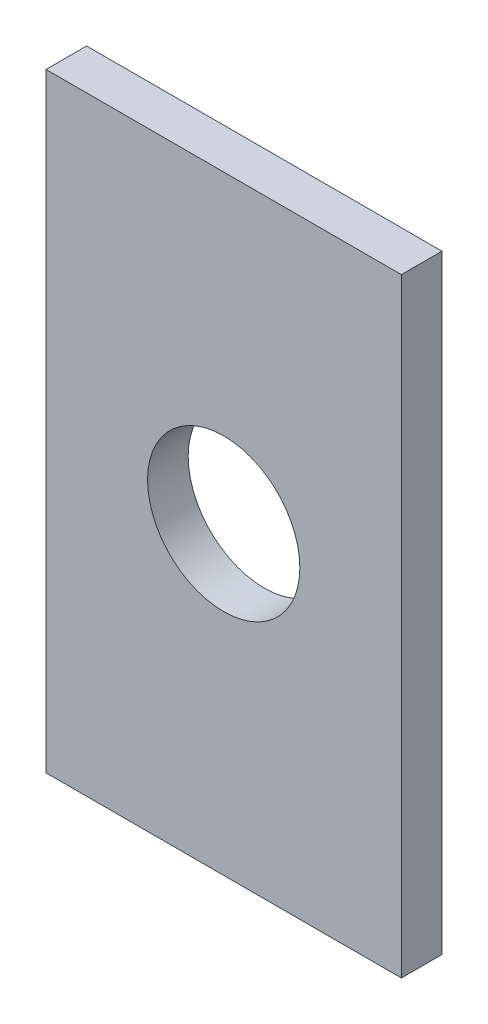
ISO-10303-21;
HEADER;
FILE_DESCRIPTION(('STEP AP214'),'2;1');
FILE_NAME('part.step','',(''),(''),'','','');
FILE_SCHEMA(('AUTOMOTIVE_DESIGN { 1 0 10303 214 1 1 1 1 }'));
ENDSEC;
DATA;
#1=APPLICATION_CONTEXT('core data for automotive mechanical design processes');
#2=APPLICATION_PROTOCOL_DEFINITION('international standard','automotive_design',2000,#1);
#3=PRODUCT_CONTEXT('',#1,'mechanical');
#4=PRODUCT('Part','Part','',(#3));
#5=PRODUCT_RELATED_PRODUCT_CATEGORY('part','',(#4));
#6=PRODUCT_DEFINITION_FORMATION('','',#4);
#7=PRODUCT_DEFINITION_CONTEXT('part definition',#1,'design');
#8=PRODUCT_DEFINITION('design','',#6,#7);
#9=PRODUCT_DEFINITION_SHAPE('','',#8);
#10=(LENGTH_UNIT() NAMED_UNIT(*) SI_UNIT(.MILLI.,.METRE.));
#11=(NAMED_UNIT(*) PLANE_ANGLE_UNIT() SI_UNIT($,.RADIAN.));
#12=(NAMED_UNIT(*) SI_UNIT($,.STERADIAN.) SOLID_ANGLE_UNIT());
#13=UNCERTAINTY_MEASURE_WITH_UNIT(LENGTH_MEASURE(1.E-05),#10,'distance_accuracy_value','');
#14=(GEOMETRIC_REPRESENTATION_CONTEXT(3) GLOBAL_UNCERTAINTY_ASSIGNED_CONTEXT((#13)) GLOBAL_UNIT_ASSIGNED_CONTEXT((#10,
#11,#12)) REPRESENTATION_CONTEXT('',''));
#15=CARTESIAN_POINT('',(0.,0.,0.));
#16=DIRECTION('',(0.,0.,1.));
#17=DIRECTION('',(1.,0.,0.));
#18=AXIS2_PLACEMENT_3D('',#15,#16,#17);
#19=CARTESIAN_POINT('',(73.5000001639128,11.5000002980232,16.3));
#20=DIRECTION('',(0.,0.,1.));
#21=DIRECTION('',(1.,0.,0.));
#22=AXIS2_PLACEMENT_3D('',#19,#20,#21);
#23=PLANE('',#22);
#24=CARTESIAN_POINT('',(73.5000001639128,11.5000002980232,16.3));
#25=DIRECTION('',(0.,0.,-1.));
#26=DIRECTION('',(-1.,0.,0.));
#27=AXIS2_PLACEMENT_3D('',#24,#25,#26);
#28=CIRCLE('',#27,1.5);
#29=CARTESIAN_POINT('',(72.0000001639128,11.5000002980232,16.3));
#30=VERTEX_POINT('',#29);
#31=EDGE_CURVE('E20',#30,#30,#28,.F.);
#32=ORIENTED_EDGE('',*,*,#31,.T.);
#33=EDGE_LOOP('',(#32));
#34=FACE_BOUND('',#33,.T.);
#35=DIRECTION('',(1.,0.,0.));
#36=VECTOR('',#35,1.);
#37=CARTESIAN_POINT('',(77.0000001639128,17.5000002980232,16.3));
#38=LINE('',#37,#36);
#39=CARTESIAN_POINT('',(77.0000001639128,17.5000002980232,16.3));
#40=VERTEX_POINT('',#39);
#41=CARTESIAN_POINT('',(70.0000001639128,17.5000002980232,16.3));
#42=VERTEX_POINT('',#41);
#43=EDGE_CURVE('E81',#40,#42,#38,.F.);
#44=ORIENTED_EDGE('',*,*,#43,.F.);
#45=DIRECTION('',(0.,1.,0.));
#46=VECTOR('',#45,1.);
#47=CARTESIAN_POINT('',(77.0000001639128,5.50000029802322,16.3));
#48=LINE('',#47,#46);
#49=CARTESIAN_POINT('',(77.0000001639128,5.50000029802322,16.3));
#50=VERTEX_POINT('',#49);
#51=EDGE_CURVE('E54',#50,#40,#48,.T.);
#52=ORIENTED_EDGE('',*,*,#51,.F.);
#53=DIRECTION('',(1.,0.,0.));
#54=VECTOR('',#53,1.);
#55=CARTESIAN_POINT('',(70.0000001639128,5.50000029802322,16.3));
#56=LINE('',#55,#54);
#57=CARTESIAN_POINT('',(70.0000001639128,5.50000029802322,16.3));
#58=VERTEX_POINT('',#57);
#59=EDGE_CURVE('E56',#58,#50,#56,.T.);
#60=ORIENTED_EDGE('',*,*,#59,.F.);
#61=DIRECTION('',(0.,1.,0.));
#62=VECTOR('',#61,1.);
#63=CARTESIAN_POINT('',(70.0000001639128,17.5000002980232,16.3));
#64=LINE('',#63,#62);
#65=EDGE_CURVE('E58',#42,#58,#64,.F.);
#66=ORIENTED_EDGE('',*,*,#65,.F.);
#67=EDGE_LOOP('',(#44,#52,#60,#66));
#68=FACE_BOUND('',#67,.T.);
#69=ADVANCED_FACE('F17',(#34,#68),#23,.F.);
#70=CARTESIAN_POINT('',(70.0000001639128,17.5000002980232,16.3));
#71=DIRECTION('',(-1.,0.,0.));
#72=DIRECTION('',(0.,0.,1.));
#73=AXIS2_PLACEMENT_3D('',#70,#71,#72);
#74=PLANE('',#73);
#75=DIRECTION('',(0.,1.,0.));
#76=VECTOR('',#75,1.);
#77=CARTESIAN_POINT('',(70.0000001639128,11.5000002980232,17.1));
#78=LINE('',#77,#76);
#79=CARTESIAN_POINT('',(70.0000001639128,17.5000002980232,17.1));
#80=VERTEX_POINT('',#79);
#81=CARTESIAN_POINT('',(70.0000001639128,5.50000029802322,17.1));
#82=VERTEX_POINT('',#81);
#83=EDGE_CURVE('E85',#80,#82,#78,.F.);
#84=ORIENTED_EDGE('',*,*,#83,.F.);
#85=DIRECTION('',(0.,0.,1.));
#86=VECTOR('',#85,1.);
#87=CARTESIAN_POINT('',(70.0000001639128,17.5000002980232,16.3));
#88=LINE('',#87,#86);
#89=EDGE_CURVE('E69',#42,#80,#88,.T.);
#90=ORIENTED_EDGE('',*,*,#89,.F.);
#91=ORIENTED_EDGE('',*,*,#65,.T.);
#92=DIRECTION('',(0.,0.,-1.));
#93=VECTOR('',#92,1.);
#94=CARTESIAN_POINT('',(70.0000001639128,5.50000029802322,16.3));
#95=LINE('',#94,#93);
#96=EDGE_CURVE('E63',#82,#58,#95,.T.);
#97=ORIENTED_EDGE('',*,*,#96,.F.);
#98=EDGE_LOOP('',(#84,#90,#91,#97));
#99=FACE_BOUND('',#98,.T.);
#100=ADVANCED_FACE('F66',(#99),#74,.T.);
#101=CARTESIAN_POINT('',(70.0000001639128,5.50000029802322,16.3));
#102=DIRECTION('',(0.,-1.,0.));
#103=DIRECTION('',(0.,0.,-1.));
#104=AXIS2_PLACEMENT_3D('',#101,#102,#103);
#105=PLANE('',#104);
#106=DIRECTION('',(1.,0.,0.));
#107=VECTOR('',#106,1.);
#108=CARTESIAN_POINT('',(73.5000001639128,5.50000029802322,17.1));
#109=LINE('',#108,#107);
#110=CARTESIAN_POINT('',(77.0000001639128,5.50000029802322,17.1));
#111=VERTEX_POINT('',#110);
#112=EDGE_CURVE('E74',#82,#111,#109,.T.);
#113=ORIENTED_EDGE('',*,*,#112,.F.);
#114=ORIENTED_EDGE('',*,*,#96,.T.);
#115=ORIENTED_EDGE('',*,*,#59,.T.);
#116=DIRECTION('',(0.,0.,-1.));
#117=VECTOR('',#116,1.);
#118=CARTESIAN_POINT('',(77.0000001639128,5.50000029802322,16.3));
#119=LINE('',#118,#117);
#120=EDGE_CURVE('E77',#111,#50,#119,.T.);
#121=ORIENTED_EDGE('',*,*,#120,.F.);
#122=EDGE_LOOP('',(#113,#114,#115,#121));
#123=FACE_BOUND('',#122,.T.);
#124=ADVANCED_FACE('F72',(#123),#105,.T.);
#125=CARTESIAN_POINT('',(77.0000001639128,5.50000029802322,16.3));
#126=DIRECTION('',(1.,0.,0.));
#127=DIRECTION('',(0.,0.,-1.));
#128=AXIS2_PLACEMENT_3D('',#125,#126,#127);
#129=PLANE('',#128);
#130=DIRECTION('',(0.,1.,0.));
#131=VECTOR('',#130,1.);
#132=CARTESIAN_POINT('',(77.0000001639128,11.5000002980232,17.1));
#133=LINE('',#132,#131);
#134=CARTESIAN_POINT('',(77.0000001639128,17.5000002980232,17.1));
#135=VERTEX_POINT('',#134);
#136=EDGE_CURVE('E88',#111,#135,#133,.T.);
#137=ORIENTED_EDGE('',*,*,#136,.F.);
#138=ORIENTED_EDGE('',*,*,#120,.T.);
#139=ORIENTED_EDGE('',*,*,#51,.T.);
#140=DIRECTION('',(0.,0.,1.));
#141=VECTOR('',#140,1.);
#142=CARTESIAN_POINT('',(77.0000001639128,17.5000002980232,16.3));
#143=LINE('',#142,#141);
#144=EDGE_CURVE('E34',#135,#40,#143,.F.);
#145=ORIENTED_EDGE('',*,*,#144,.F.);
#146=EDGE_LOOP('',(#137,#138,#139,#145));
#147=FACE_BOUND('',#146,.T.);
#148=ADVANCED_FACE('F96',(#147),#129,.T.);
#149=CARTESIAN_POINT('',(77.0000001639128,17.5000002980232,16.3));
#150=DIRECTION('',(0.,1.,0.));
#151=DIRECTION('',(0.,0.,1.));
#152=AXIS2_PLACEMENT_3D('',#149,#150,#151);
#153=PLANE('',#152);
#154=DIRECTION('',(1.,0.,0.));
#155=VECTOR('',#154,1.);
#156=CARTESIAN_POINT('',(73.5000001639128,17.5000002980232,17.1));
#157=LINE('',#156,#155);
#158=EDGE_CURVE('E26',#135,#80,#157,.F.);
#159=ORIENTED_EDGE('',*,*,#158,.F.);
#160=ORIENTED_EDGE('',*,*,#144,.T.);
#161=ORIENTED_EDGE('',*,*,#43,.T.);
#162=ORIENTED_EDGE('',*,*,#89,.T.);
#163=EDGE_LOOP('',(#159,#160,#161,#162));
#164=FACE_BOUND('',#163,.T.);
#165=ADVANCED_FACE('F95',(#164),#153,.T.);
#166=CARTESIAN_POINT('',(73.5000001639128,11.5000002980232,17.1));
#167=DIRECTION('',(0.,0.,-1.));
#168=DIRECTION('',(-1.,0.,0.));
#169=AXIS2_PLACEMENT_3D('',#166,#167,#168);
#170=CYLINDRICAL_SURFACE('',#169,1.5);
#171=ORIENTED_EDGE('',*,*,#31,.F.);
#172=EDGE_LOOP('',(#171));
#173=FACE_BOUND('',#172,.T.);
#174=CARTESIAN_POINT('',(73.5000001639128,11.5000002980232,17.1));
#175=DIRECTION('',(0.,0.,-1.));
#176=DIRECTION('',(-1.,0.,0.));
#177=AXIS2_PLACEMENT_3D('',#174,#175,#176);
#178=CIRCLE('',#177,1.5);
#179=CARTESIAN_POINT('',(72.0000001639128,11.5000002980232,17.1));
#180=VERTEX_POINT('',#179);
#181=EDGE_CURVE('E11',#180,#180,#178,.T.);
#182=ORIENTED_EDGE('',*,*,#181,.F.);
#183=EDGE_LOOP('',(#182));
#184=FACE_BOUND('',#183,.T.);
#185=ADVANCED_FACE('F104',(#173,#184),#170,.F.);
#186=CARTESIAN_POINT('',(73.5000001639128,11.5000002980232,17.1));
#187=DIRECTION('',(0.,0.,1.));
#188=DIRECTION('',(1.,0.,0.));
#189=AXIS2_PLACEMENT_3D('',#186,#187,#188);
#190=PLANE('',#189);
#191=ORIENTED_EDGE('',*,*,#181,.T.);
#192=EDGE_LOOP('',(#191));
#193=FACE_BOUND('',#192,.T.);
#194=ORIENTED_EDGE('',*,*,#136,.T.);
#195=ORIENTED_EDGE('',*,*,#158,.T.);
#196=ORIENTED_EDGE('',*,*,#83,.T.);
#197=ORIENTED_EDGE('',*,*,#112,.T.);
#198=EDGE_LOOP('',(#194,#195,#196,#197));
#199=FACE_BOUND('',#198,.T.);
#200=ADVANCED_FACE('F93',(#193,#199),#190,.T.);
#201=CLOSED_SHELL('',(#69,#100,#124,#148,#165,#185,#200));
#202=MANIFOLD_SOLID_BREP('B1',#201);
#203=ADVANCED_BREP_SHAPE_REPRESENTATION('',(#18,#202),#14);
#204=SHAPE_DEFINITION_REPRESENTATION(#9,#203);
ENDSEC;
END-ISO-10303-21;
